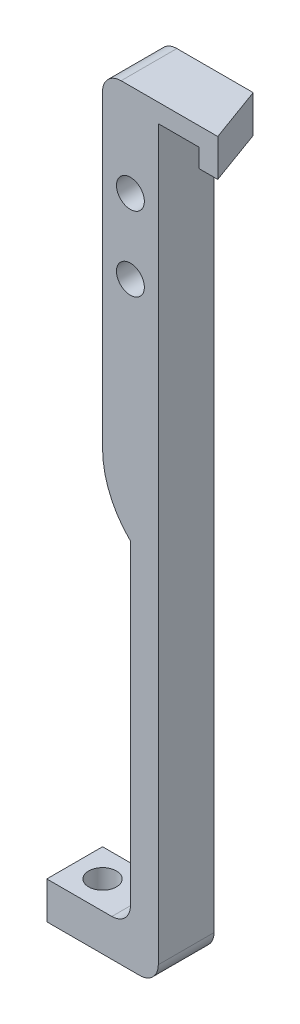
ISO-10303-21;
HEADER;
FILE_DESCRIPTION(('STEP AP214'),'2;1');
FILE_NAME('part.step','',(''),(''),'','','');
FILE_SCHEMA(('AUTOMOTIVE_DESIGN { 1 0 10303 214 1 1 1 1 }'));
ENDSEC;
DATA;
#1=APPLICATION_CONTEXT('core data for automotive mechanical design processes');
#2=APPLICATION_PROTOCOL_DEFINITION('international standard','automotive_design',2000,#1);
#3=PRODUCT_CONTEXT('',#1,'mechanical');
#4=PRODUCT('Part','Part','',(#3));
#5=PRODUCT_RELATED_PRODUCT_CATEGORY('part','',(#4));
#6=PRODUCT_DEFINITION_FORMATION('','',#4);
#7=PRODUCT_DEFINITION_CONTEXT('part definition',#1,'design');
#8=PRODUCT_DEFINITION('design','',#6,#7);
#9=PRODUCT_DEFINITION_SHAPE('','',#8);
#10=(LENGTH_UNIT() NAMED_UNIT(*) SI_UNIT(.MILLI.,.METRE.));
#11=(NAMED_UNIT(*) PLANE_ANGLE_UNIT() SI_UNIT($,.RADIAN.));
#12=(NAMED_UNIT(*) SI_UNIT($,.STERADIAN.) SOLID_ANGLE_UNIT());
#13=UNCERTAINTY_MEASURE_WITH_UNIT(LENGTH_MEASURE(1.E-05),#10,'distance_accuracy_value','');
#14=(GEOMETRIC_REPRESENTATION_CONTEXT(3) GLOBAL_UNCERTAINTY_ASSIGNED_CONTEXT((#13)) GLOBAL_UNIT_ASSIGNED_CONTEXT((#10,
#11,#12)) REPRESENTATION_CONTEXT('',''));
#15=CARTESIAN_POINT('',(0.,0.,0.));
#16=DIRECTION('',(0.,0.,1.));
#17=DIRECTION('',(1.,0.,0.));
#18=AXIS2_PLACEMENT_3D('',#15,#16,#17);
#19=CARTESIAN_POINT('',(15.748,102.108,0.));
#20=DIRECTION('',(0.,1.,0.));
#21=DIRECTION('',(0.,0.,1.));
#22=AXIS2_PLACEMENT_3D('',#19,#20,#21);
#23=PLANE('',#22);
#24=DIRECTION('',(-0.342020143325663,0.,-0.93969262078591));
#25=VECTOR('',#24,1.);
#26=CARTESIAN_POINT('',(10.4345468148915,102.108,-7.62));
#27=LINE('',#26,#25);
#28=CARTESIAN_POINT('',(13.2079999999999,102.108,0.));
#29=VERTEX_POINT('',#28);
#30=CARTESIAN_POINT('',(10.4345468148915,102.108,-7.62));
#31=VERTEX_POINT('',#30);
#32=EDGE_CURVE('E179',#29,#31,#27,.T.);
#33=ORIENTED_EDGE('',*,*,#32,.F.);
#34=DIRECTION('',(-1.,0.,0.));
#35=VECTOR('',#34,1.);
#36=CARTESIAN_POINT('',(15.748,102.108,0.));
#37=LINE('',#36,#35);
#38=CARTESIAN_POINT('',(7.62,102.108,0.));
#39=VERTEX_POINT('',#38);
#40=EDGE_CURVE('E221',#29,#39,#37,.T.);
#41=ORIENTED_EDGE('',*,*,#40,.T.);
#42=DIRECTION('',(0.,0.,-1.));
#43=VECTOR('',#42,1.);
#44=CARTESIAN_POINT('',(7.62,102.108,0.));
#45=LINE('',#44,#43);
#46=CARTESIAN_POINT('',(7.62,102.108,-7.62));
#47=VERTEX_POINT('',#46);
#48=EDGE_CURVE('E200',#39,#47,#45,.T.);
#49=ORIENTED_EDGE('',*,*,#48,.T.);
#50=DIRECTION('',(-1.,0.,0.));
#51=VECTOR('',#50,1.);
#52=CARTESIAN_POINT('',(15.748,102.108,-7.62));
#53=LINE('',#52,#51);
#54=EDGE_CURVE('E203',#31,#47,#53,.T.);
#55=ORIENTED_EDGE('',*,*,#54,.F.);
#56=EDGE_LOOP('',(#33,#41,#49,#55));
#57=FACE_BOUND('',#56,.T.);
#58=ADVANCED_FACE('F33',(#57),#23,.F.);
#59=CARTESIAN_POINT('',(7.62,0.,0.));
#60=DIRECTION('',(-1.,0.,0.));
#61=DIRECTION('',(0.,0.,1.));
#62=AXIS2_PLACEMENT_3D('',#59,#60,#61);
#63=PLANE('',#62);
#64=DIRECTION('',(0.,-1.,0.));
#65=VECTOR('',#64,1.);
#66=CARTESIAN_POINT('',(7.62,0.,0.));
#67=LINE('',#66,#65);
#68=CARTESIAN_POINT('',(7.62,2.54,0.));
#69=VERTEX_POINT('',#68);
#70=EDGE_CURVE('E212',#39,#69,#67,.T.);
#71=ORIENTED_EDGE('',*,*,#70,.T.);
#72=DIRECTION('',(0.,0.,-1.));
#73=VECTOR('',#72,1.);
#74=CARTESIAN_POINT('',(7.62,2.54,0.));
#75=LINE('',#74,#73);
#76=CARTESIAN_POINT('',(7.62,2.54,-7.62));
#77=VERTEX_POINT('',#76);
#78=EDGE_CURVE('E162',#69,#77,#75,.T.);
#79=ORIENTED_EDGE('',*,*,#78,.T.);
#80=DIRECTION('',(0.,1.,0.));
#81=VECTOR('',#80,1.);
#82=CARTESIAN_POINT('',(7.62,0.,-7.62));
#83=LINE('',#82,#81);
#84=EDGE_CURVE('E237',#77,#47,#83,.T.);
#85=ORIENTED_EDGE('',*,*,#84,.T.);
#86=ORIENTED_EDGE('',*,*,#48,.F.);
#87=EDGE_LOOP('',(#71,#79,#85,#86));
#88=FACE_BOUND('',#87,.T.);
#89=ADVANCED_FACE('F290',(#88),#63,.F.);
#90=CARTESIAN_POINT('',(7.62,0.,0.));
#91=DIRECTION('',(0.,0.,-1.));
#92=DIRECTION('',(-1.,0.,0.));
#93=AXIS2_PLACEMENT_3D('',#90,#91,#92);
#94=PLANE('',#93);
#95=CARTESIAN_POINT('',(3.81,81.788,0.));
#96=DIRECTION('',(0.,0.,1.));
#97=DIRECTION('',(1.,0.,0.));
#98=AXIS2_PLACEMENT_3D('',#95,#96,#97);
#99=CIRCLE('',#98,1.90500000000001);
#100=CARTESIAN_POINT('',(5.71500000000001,81.788,0.));
#101=VERTEX_POINT('',#100);
#102=EDGE_CURVE('E279',#101,#101,#99,.T.);
#103=ORIENTED_EDGE('',*,*,#102,.F.);
#104=EDGE_LOOP('',(#103));
#105=FACE_BOUND('',#104,.T.);
#106=CARTESIAN_POINT('',(3.81,91.948,0.));
#107=DIRECTION('',(0.,0.,1.));
#108=DIRECTION('',(1.,0.,0.));
#109=AXIS2_PLACEMENT_3D('',#106,#107,#108);
#110=CIRCLE('',#109,1.90500000000001);
#111=CARTESIAN_POINT('',(5.71500000000001,91.948,0.));
#112=VERTEX_POINT('',#111);
#113=EDGE_CURVE('E271',#112,#112,#110,.T.);
#114=ORIENTED_EDGE('',*,*,#113,.F.);
#115=EDGE_LOOP('',(#114));
#116=FACE_BOUND('',#115,.T.);
#117=DIRECTION('',(-1.,0.,0.));
#118=VECTOR('',#117,1.);
#119=CARTESIAN_POINT('',(7.62,0.,0.));
#120=LINE('',#119,#118);
#121=CARTESIAN_POINT('',(5.08,0.,0.));
#122=VERTEX_POINT('',#121);
#123=CARTESIAN_POINT('',(-7.62,0.,0.));
#124=VERTEX_POINT('',#123);
#125=EDGE_CURVE('E242',#122,#124,#120,.T.);
#126=ORIENTED_EDGE('',*,*,#125,.F.);
#127=CARTESIAN_POINT('',(5.08,2.54,0.));
#128=DIRECTION('',(0.,0.,-1.));
#129=DIRECTION('',(-1.,0.,0.));
#130=AXIS2_PLACEMENT_3D('',#127,#128,#129);
#131=CIRCLE('',#130,2.54);
#132=EDGE_CURVE('E260',#122,#69,#131,.F.);
#133=ORIENTED_EDGE('',*,*,#132,.T.);
#134=ORIENTED_EDGE('',*,*,#70,.F.);
#135=ORIENTED_EDGE('',*,*,#40,.F.);
#136=DIRECTION('',(0.,1.,0.));
#137=VECTOR('',#136,1.);
#138=CARTESIAN_POINT('',(13.2079999999999,99.568,0.));
#139=LINE('',#138,#137);
#140=CARTESIAN_POINT('',(13.2079999999999,99.568,0.));
#141=VERTEX_POINT('',#140);
#142=EDGE_CURVE('E197',#141,#29,#139,.T.);
#143=ORIENTED_EDGE('',*,*,#142,.F.);
#144=DIRECTION('',(-1.,0.,0.));
#145=VECTOR('',#144,1.);
#146=CARTESIAN_POINT('',(15.748,99.568,0.));
#147=LINE('',#146,#145);
#148=CARTESIAN_POINT('',(15.748,99.568,0.));
#149=VERTEX_POINT('',#148);
#150=EDGE_CURVE('E180',#149,#141,#147,.T.);
#151=ORIENTED_EDGE('',*,*,#150,.F.);
#152=DIRECTION('',(0.,-1.,0.));
#153=VECTOR('',#152,1.);
#154=CARTESIAN_POINT('',(15.748,104.648,0.));
#155=LINE('',#154,#153);
#156=CARTESIAN_POINT('',(15.748,104.648,0.));
#157=VERTEX_POINT('',#156);
#158=EDGE_CURVE('E201',#157,#149,#155,.T.);
#159=ORIENTED_EDGE('',*,*,#158,.F.);
#160=DIRECTION('',(-1.,0.,0.));
#161=VECTOR('',#160,1.);
#162=CARTESIAN_POINT('',(7.62,104.648,0.));
#163=LINE('',#162,#161);
#164=CARTESIAN_POINT('',(2.54,104.648,0.));
#165=VERTEX_POINT('',#164);
#166=EDGE_CURVE('E233',#157,#165,#163,.T.);
#167=ORIENTED_EDGE('',*,*,#166,.T.);
#168=CARTESIAN_POINT('',(2.54,102.108,0.));
#169=DIRECTION('',(0.,0.,-1.));
#170=DIRECTION('',(-1.,0.,0.));
#171=AXIS2_PLACEMENT_3D('',#168,#169,#170);
#172=CIRCLE('',#171,2.54);
#173=CARTESIAN_POINT('',(0.,102.108,0.));
#174=VERTEX_POINT('',#173);
#175=EDGE_CURVE('E50',#165,#174,#172,.F.);
#176=ORIENTED_EDGE('',*,*,#175,.T.);
#177=DIRECTION('',(0.,-1.,0.));
#178=VECTOR('',#177,1.);
#179=CARTESIAN_POINT('',(0.,0.,0.));
#180=LINE('',#179,#178);
#181=CARTESIAN_POINT('',(0.,59.8696141042494,0.));
#182=VERTEX_POINT('',#181);
#183=EDGE_CURVE('E158',#174,#182,#180,.T.);
#184=ORIENTED_EDGE('',*,*,#183,.T.);
#185=CARTESIAN_POINT('',(12.7,59.8696141042494,0.));
#186=DIRECTION('',(0.,0.,-1.));
#187=DIRECTION('',(-1.,0.,0.));
#188=AXIS2_PLACEMENT_3D('',#185,#186,#187);
#189=CIRCLE('',#188,12.7);
#190=CARTESIAN_POINT('',(3.81,50.8,0.));
#191=VERTEX_POINT('',#190);
#192=EDGE_CURVE('E154',#182,#191,#189,.F.);
#193=ORIENTED_EDGE('',*,*,#192,.T.);
#194=DIRECTION('',(0.,1.,0.));
#195=VECTOR('',#194,1.);
#196=CARTESIAN_POINT('',(3.81,5.08,0.));
#197=LINE('',#196,#195);
#198=CARTESIAN_POINT('',(3.81,7.62,0.));
#199=VERTEX_POINT('',#198);
#200=EDGE_CURVE('E142',#199,#191,#197,.T.);
#201=ORIENTED_EDGE('',*,*,#200,.F.);
#202=CARTESIAN_POINT('',(1.27,7.62,0.));
#203=DIRECTION('',(0.,0.,-1.));
#204=DIRECTION('',(-1.,0.,0.));
#205=AXIS2_PLACEMENT_3D('',#202,#203,#204);
#206=CIRCLE('',#205,2.54);
#207=CARTESIAN_POINT('',(1.27,5.08,0.));
#208=VERTEX_POINT('',#207);
#209=EDGE_CURVE('E42',#199,#208,#206,.T.);
#210=ORIENTED_EDGE('',*,*,#209,.T.);
#211=DIRECTION('',(1.,0.,0.));
#212=VECTOR('',#211,1.);
#213=CARTESIAN_POINT('',(-7.62,5.08,0.));
#214=LINE('',#213,#212);
#215=CARTESIAN_POINT('',(-7.62,5.08,0.));
#216=VERTEX_POINT('',#215);
#217=EDGE_CURVE('E247',#216,#208,#214,.T.);
#218=ORIENTED_EDGE('',*,*,#217,.F.);
#219=DIRECTION('',(0.,1.,0.));
#220=VECTOR('',#219,1.);
#221=CARTESIAN_POINT('',(-7.62,0.,0.));
#222=LINE('',#221,#220);
#223=EDGE_CURVE('E206',#124,#216,#222,.T.);
#224=ORIENTED_EDGE('',*,*,#223,.F.);
#225=EDGE_LOOP('',(#126,#133,#134,#135,#143,#151,#159,#167,#176,#184,#193,#201,#210,#218,#224));
#226=FACE_BOUND('',#225,.T.);
#227=ADVANCED_FACE('F156',(#105,#116,#226),#94,.F.);
#228=CARTESIAN_POINT('',(7.62,0.,0.));
#229=DIRECTION('',(0.,1.,0.));
#230=DIRECTION('',(0.,0.,1.));
#231=AXIS2_PLACEMENT_3D('',#228,#229,#230);
#232=PLANE('',#231);
#233=CARTESIAN_POINT('',(-3.81,0.,-3.81));
#234=DIRECTION('',(0.,1.,0.));
#235=DIRECTION('',(0.,0.,1.));
#236=AXIS2_PLACEMENT_3D('',#233,#234,#235);
#237=CIRCLE('',#236,1.89865);
#238=CARTESIAN_POINT('',(-3.81,0.,-1.91135));
#239=VERTEX_POINT('',#238);
#240=EDGE_CURVE('E176',#239,#239,#237,.T.);
#241=ORIENTED_EDGE('',*,*,#240,.T.);
#242=EDGE_LOOP('',(#241));
#243=FACE_BOUND('',#242,.T.);
#244=DIRECTION('',(-1.,0.,0.));
#245=VECTOR('',#244,1.);
#246=CARTESIAN_POINT('',(7.62,0.,-7.62));
#247=LINE('',#246,#245);
#248=CARTESIAN_POINT('',(5.08,0.,-7.62));
#249=VERTEX_POINT('',#248);
#250=CARTESIAN_POINT('',(-7.62,0.,-7.62));
#251=VERTEX_POINT('',#250);
#252=EDGE_CURVE('E240',#249,#251,#247,.T.);
#253=ORIENTED_EDGE('',*,*,#252,.F.);
#254=DIRECTION('',(0.,0.,-1.));
#255=VECTOR('',#254,1.);
#256=CARTESIAN_POINT('',(5.08,0.,0.));
#257=LINE('',#256,#255);
#258=EDGE_CURVE('E257',#249,#122,#257,.F.);
#259=ORIENTED_EDGE('',*,*,#258,.T.);
#260=ORIENTED_EDGE('',*,*,#125,.T.);
#261=DIRECTION('',(0.,0.,1.));
#262=VECTOR('',#261,1.);
#263=CARTESIAN_POINT('',(-7.62,0.,0.));
#264=LINE('',#263,#262);
#265=EDGE_CURVE('E248',#251,#124,#264,.T.);
#266=ORIENTED_EDGE('',*,*,#265,.F.);
#267=EDGE_LOOP('',(#253,#259,#260,#266));
#268=FACE_BOUND('',#267,.T.);
#269=ADVANCED_FACE('F289',(#243,#268),#232,.F.);
#270=CARTESIAN_POINT('',(7.62,0.,-7.62));
#271=DIRECTION('',(0.,0.,1.));
#272=DIRECTION('',(1.,0.,0.));
#273=AXIS2_PLACEMENT_3D('',#270,#271,#272);
#274=PLANE('',#273);
#275=CARTESIAN_POINT('',(3.81,81.788,-7.62));
#276=DIRECTION('',(0.,0.,1.));
#277=DIRECTION('',(1.,0.,0.));
#278=AXIS2_PLACEMENT_3D('',#275,#276,#277);
#279=CIRCLE('',#278,1.90500000000001);
#280=CARTESIAN_POINT('',(5.71500000000001,81.788,-7.62));
#281=VERTEX_POINT('',#280);
#282=EDGE_CURVE('E37',#281,#281,#279,.T.);
#283=ORIENTED_EDGE('',*,*,#282,.T.);
#284=EDGE_LOOP('',(#283));
#285=FACE_BOUND('',#284,.T.);
#286=CARTESIAN_POINT('',(3.81,91.948,-7.62));
#287=DIRECTION('',(0.,0.,1.));
#288=DIRECTION('',(1.,0.,0.));
#289=AXIS2_PLACEMENT_3D('',#286,#287,#288);
#290=CIRCLE('',#289,1.90500000000001);
#291=CARTESIAN_POINT('',(5.71500000000001,91.948,-7.62));
#292=VERTEX_POINT('',#291);
#293=EDGE_CURVE('E269',#292,#292,#290,.T.);
#294=ORIENTED_EDGE('',*,*,#293,.T.);
#295=EDGE_LOOP('',(#294));
#296=FACE_BOUND('',#295,.T.);
#297=ORIENTED_EDGE('',*,*,#84,.F.);
#298=CARTESIAN_POINT('',(5.08,2.54,-7.62));
#299=DIRECTION('',(0.,0.,1.));
#300=DIRECTION('',(1.,0.,0.));
#301=AXIS2_PLACEMENT_3D('',#298,#299,#300);
#302=CIRCLE('',#301,2.54);
#303=EDGE_CURVE('E334',#77,#249,#302,.F.);
#304=ORIENTED_EDGE('',*,*,#303,.T.);
#305=ORIENTED_EDGE('',*,*,#252,.T.);
#306=DIRECTION('',(0.,-1.,0.));
#307=VECTOR('',#306,1.);
#308=CARTESIAN_POINT('',(-7.62,0.,-7.62));
#309=LINE('',#308,#307);
#310=CARTESIAN_POINT('',(-7.62,5.08,-7.62));
#311=VERTEX_POINT('',#310);
#312=EDGE_CURVE('E347',#311,#251,#309,.T.);
#313=ORIENTED_EDGE('',*,*,#312,.F.);
#314=DIRECTION('',(1.,0.,0.));
#315=VECTOR('',#314,1.);
#316=CARTESIAN_POINT('',(-7.62,5.08,-7.62));
#317=LINE('',#316,#315);
#318=CARTESIAN_POINT('',(1.27,5.08,-7.62));
#319=VERTEX_POINT('',#318);
#320=EDGE_CURVE('E244',#311,#319,#317,.T.);
#321=ORIENTED_EDGE('',*,*,#320,.T.);
#322=CARTESIAN_POINT('',(1.27,7.62,-7.62));
#323=DIRECTION('',(0.,0.,1.));
#324=DIRECTION('',(1.,0.,0.));
#325=AXIS2_PLACEMENT_3D('',#322,#323,#324);
#326=CIRCLE('',#325,2.54);
#327=CARTESIAN_POINT('',(3.81,7.62,-7.62));
#328=VERTEX_POINT('',#327);
#329=EDGE_CURVE('E11',#319,#328,#326,.T.);
#330=ORIENTED_EDGE('',*,*,#329,.T.);
#331=DIRECTION('',(0.,-1.,0.));
#332=VECTOR('',#331,1.);
#333=CARTESIAN_POINT('',(3.81,5.08,-7.62));
#334=LINE('',#333,#332);
#335=CARTESIAN_POINT('',(3.81,50.8,-7.62));
#336=VERTEX_POINT('',#335);
#337=EDGE_CURVE('E151',#336,#328,#334,.T.);
#338=ORIENTED_EDGE('',*,*,#337,.F.);
#339=CARTESIAN_POINT('',(12.7,59.8696141042494,-7.62));
#340=DIRECTION('',(0.,0.,1.));
#341=DIRECTION('',(1.,0.,0.));
#342=AXIS2_PLACEMENT_3D('',#339,#340,#341);
#343=CIRCLE('',#342,12.7);
#344=CARTESIAN_POINT('',(0.,59.8696141042494,-7.62));
#345=VERTEX_POINT('',#344);
#346=EDGE_CURVE('E166',#336,#345,#343,.F.);
#347=ORIENTED_EDGE('',*,*,#346,.T.);
#348=DIRECTION('',(0.,1.,0.));
#349=VECTOR('',#348,1.);
#350=CARTESIAN_POINT('',(0.,0.,-7.62));
#351=LINE('',#350,#349);
#352=CARTESIAN_POINT('',(0.,102.108,-7.62));
#353=VERTEX_POINT('',#352);
#354=EDGE_CURVE('E223',#345,#353,#351,.T.);
#355=ORIENTED_EDGE('',*,*,#354,.T.);
#356=CARTESIAN_POINT('',(2.54,102.108,-7.62));
#357=DIRECTION('',(0.,0.,1.));
#358=DIRECTION('',(1.,0.,0.));
#359=AXIS2_PLACEMENT_3D('',#356,#357,#358);
#360=CIRCLE('',#359,2.54);
#361=CARTESIAN_POINT('',(2.54,104.648,-7.62));
#362=VERTEX_POINT('',#361);
#363=EDGE_CURVE('E361',#353,#362,#360,.F.);
#364=ORIENTED_EDGE('',*,*,#363,.T.);
#365=DIRECTION('',(-1.,0.,0.));
#366=VECTOR('',#365,1.);
#367=CARTESIAN_POINT('',(7.62,104.648,-7.62));
#368=LINE('',#367,#366);
#369=CARTESIAN_POINT('',(12.9745468148915,104.648,-7.62));
#370=VERTEX_POINT('',#369);
#371=EDGE_CURVE('E236',#370,#362,#368,.T.);
#372=ORIENTED_EDGE('',*,*,#371,.F.);
#373=DIRECTION('',(0.,1.,0.));
#374=VECTOR('',#373,1.);
#375=CARTESIAN_POINT('',(12.9745468148915,99.568,-7.62));
#376=LINE('',#375,#374);
#377=CARTESIAN_POINT('',(12.9745468148915,99.568,-7.62));
#378=VERTEX_POINT('',#377);
#379=EDGE_CURVE('E190',#378,#370,#376,.T.);
#380=ORIENTED_EDGE('',*,*,#379,.F.);
#381=DIRECTION('',(1.,0.,0.));
#382=VECTOR('',#381,1.);
#383=CARTESIAN_POINT('',(10.4345468148915,99.568,-7.62));
#384=LINE('',#383,#382);
#385=CARTESIAN_POINT('',(10.4345468148915,99.568,-7.62));
#386=VERTEX_POINT('',#385);
#387=EDGE_CURVE('E185',#386,#378,#384,.T.);
#388=ORIENTED_EDGE('',*,*,#387,.F.);
#389=DIRECTION('',(0.,1.,0.));
#390=VECTOR('',#389,1.);
#391=CARTESIAN_POINT('',(10.4345468148915,99.568,-7.62));
#392=LINE('',#391,#390);
#393=EDGE_CURVE('E194',#386,#31,#392,.T.);
#394=ORIENTED_EDGE('',*,*,#393,.T.);
#395=ORIENTED_EDGE('',*,*,#54,.T.);
#396=EDGE_LOOP('',(#297,#304,#305,#313,#321,#330,#338,#347,#355,#364,#372,#380,#388,#394,#395));
#397=FACE_BOUND('',#396,.T.);
#398=ADVANCED_FACE('F296',(#285,#296,#397),#274,.F.);
#399=CARTESIAN_POINT('',(7.62,104.648,0.));
#400=DIRECTION('',(0.,-1.,0.));
#401=DIRECTION('',(0.,0.,-1.));
#402=AXIS2_PLACEMENT_3D('',#399,#400,#401);
#403=PLANE('',#402);
#404=ORIENTED_EDGE('',*,*,#371,.T.);
#405=DIRECTION('',(0.,0.,1.));
#406=VECTOR('',#405,1.);
#407=CARTESIAN_POINT('',(2.54,104.648,0.));
#408=LINE('',#407,#406);
#409=EDGE_CURVE('E262',#362,#165,#408,.T.);
#410=ORIENTED_EDGE('',*,*,#409,.T.);
#411=ORIENTED_EDGE('',*,*,#166,.F.);
#412=DIRECTION('',(-0.342020143325669,0.,-0.939692620785908));
#413=VECTOR('',#412,1.);
#414=CARTESIAN_POINT('',(12.9745468148915,104.648,-7.62));
#415=LINE('',#414,#413);
#416=EDGE_CURVE('E167',#157,#370,#415,.T.);
#417=ORIENTED_EDGE('',*,*,#416,.T.);
#418=EDGE_LOOP('',(#404,#410,#411,#417));
#419=FACE_BOUND('',#418,.T.);
#420=ADVANCED_FACE('F322',(#419),#403,.F.);
#421=CARTESIAN_POINT('',(0.,0.,0.));
#422=DIRECTION('',(-1.,0.,0.));
#423=DIRECTION('',(0.,0.,1.));
#424=AXIS2_PLACEMENT_3D('',#421,#422,#423);
#425=PLANE('',#424);
#426=ORIENTED_EDGE('',*,*,#183,.F.);
#427=DIRECTION('',(0.,0.,1.));
#428=VECTOR('',#427,1.);
#429=CARTESIAN_POINT('',(0.,102.108,-7.62));
#430=LINE('',#429,#428);
#431=EDGE_CURVE('E264',#174,#353,#430,.F.);
#432=ORIENTED_EDGE('',*,*,#431,.T.);
#433=ORIENTED_EDGE('',*,*,#354,.F.);
#434=DIRECTION('',(0.,0.,1.));
#435=VECTOR('',#434,1.);
#436=CARTESIAN_POINT('',(0.,59.8696141042494,0.));
#437=LINE('',#436,#435);
#438=EDGE_CURVE('E163',#345,#182,#437,.T.);
#439=ORIENTED_EDGE('',*,*,#438,.T.);
#440=EDGE_LOOP('',(#426,#432,#433,#439));
#441=FACE_BOUND('',#440,.T.);
#442=ADVANCED_FACE('F317',(#441),#425,.T.);
#443=CARTESIAN_POINT('',(-7.62,5.08,0.));
#444=DIRECTION('',(0.,-1.,0.));
#445=DIRECTION('',(0.,0.,-1.));
#446=AXIS2_PLACEMENT_3D('',#443,#444,#445);
#447=PLANE('',#446);
#448=CARTESIAN_POINT('',(-3.81,5.08,-3.81));
#449=DIRECTION('',(0.,1.,0.));
#450=DIRECTION('',(0.,0.,1.));
#451=AXIS2_PLACEMENT_3D('',#448,#449,#450);
#452=CIRCLE('',#451,1.89865);
#453=CARTESIAN_POINT('',(-3.81,5.08,-1.91135));
#454=VERTEX_POINT('',#453);
#455=EDGE_CURVE('E170',#454,#454,#452,.T.);
#456=ORIENTED_EDGE('',*,*,#455,.F.);
#457=EDGE_LOOP('',(#456));
#458=FACE_BOUND('',#457,.T.);
#459=ORIENTED_EDGE('',*,*,#217,.T.);
#460=DIRECTION('',(0.,0.,1.));
#461=VECTOR('',#460,1.);
#462=CARTESIAN_POINT('',(1.27,5.08,-7.62));
#463=LINE('',#462,#461);
#464=EDGE_CURVE('E267',#208,#319,#463,.F.);
#465=ORIENTED_EDGE('',*,*,#464,.T.);
#466=ORIENTED_EDGE('',*,*,#320,.F.);
#467=DIRECTION('',(0.,0.,-1.));
#468=VECTOR('',#467,1.);
#469=CARTESIAN_POINT('',(-7.62,5.08,0.));
#470=LINE('',#469,#468);
#471=EDGE_CURVE('E349',#216,#311,#470,.T.);
#472=ORIENTED_EDGE('',*,*,#471,.F.);
#473=EDGE_LOOP('',(#459,#465,#466,#472));
#474=FACE_BOUND('',#473,.T.);
#475=ADVANCED_FACE('F314',(#458,#474),#447,.F.);
#476=CARTESIAN_POINT('',(-7.62,0.,0.));
#477=DIRECTION('',(-1.,0.,0.));
#478=DIRECTION('',(0.,0.,1.));
#479=AXIS2_PLACEMENT_3D('',#476,#477,#478);
#480=PLANE('',#479);
#481=ORIENTED_EDGE('',*,*,#223,.T.);
#482=ORIENTED_EDGE('',*,*,#471,.T.);
#483=ORIENTED_EDGE('',*,*,#312,.T.);
#484=ORIENTED_EDGE('',*,*,#265,.T.);
#485=EDGE_LOOP('',(#481,#482,#483,#484));
#486=FACE_BOUND('',#485,.T.);
#487=ADVANCED_FACE('F311',(#486),#480,.T.);
#488=CARTESIAN_POINT('',(10.4345468148915,99.568,-7.62));
#489=DIRECTION('',(0.939692620785911,0.,-0.342020143325663));
#490=DIRECTION('',(-0.342020143325663,0.,-0.939692620785911));
#491=AXIS2_PLACEMENT_3D('',#488,#489,#490);
#492=PLANE('',#491);
#493=ORIENTED_EDGE('',*,*,#32,.T.);
#494=ORIENTED_EDGE('',*,*,#393,.F.);
#495=DIRECTION('',(-0.342020143325663,0.,-0.93969262078591));
#496=VECTOR('',#495,1.);
#497=CARTESIAN_POINT('',(10.4345468148915,99.568,-7.62));
#498=LINE('',#497,#496);
#499=EDGE_CURVE('E183',#141,#386,#498,.T.);
#500=ORIENTED_EDGE('',*,*,#499,.F.);
#501=ORIENTED_EDGE('',*,*,#142,.T.);
#502=EDGE_LOOP('',(#493,#494,#500,#501));
#503=FACE_BOUND('',#502,.T.);
#504=ADVANCED_FACE('F309',(#503),#492,.F.);
#505=CARTESIAN_POINT('',(15.748,99.568,0.));
#506=DIRECTION('',(-0.939692620785908,0.,0.342020143325669));
#507=DIRECTION('',(0.342020143325669,0.,0.939692620785908));
#508=AXIS2_PLACEMENT_3D('',#505,#506,#507);
#509=PLANE('',#508);
#510=ORIENTED_EDGE('',*,*,#379,.T.);
#511=ORIENTED_EDGE('',*,*,#416,.F.);
#512=ORIENTED_EDGE('',*,*,#158,.T.);
#513=DIRECTION('',(0.342020143325669,0.,0.939692620785908));
#514=VECTOR('',#513,1.);
#515=CARTESIAN_POINT('',(15.748,99.568,0.));
#516=LINE('',#515,#514);
#517=EDGE_CURVE('E187',#378,#149,#516,.T.);
#518=ORIENTED_EDGE('',*,*,#517,.F.);
#519=EDGE_LOOP('',(#510,#511,#512,#518));
#520=FACE_BOUND('',#519,.T.);
#521=ADVANCED_FACE('F394',(#520),#509,.F.);
#522=CARTESIAN_POINT('',(0.,99.568,0.));
#523=DIRECTION('',(0.,1.,0.));
#524=DIRECTION('',(0.,0.,1.));
#525=AXIS2_PLACEMENT_3D('',#522,#523,#524);
#526=PLANE('',#525);
#527=ORIENTED_EDGE('',*,*,#150,.T.);
#528=ORIENTED_EDGE('',*,*,#499,.T.);
#529=ORIENTED_EDGE('',*,*,#387,.T.);
#530=ORIENTED_EDGE('',*,*,#517,.T.);
#531=EDGE_LOOP('',(#527,#528,#529,#530));
#532=FACE_BOUND('',#531,.T.);
#533=ADVANCED_FACE('F388',(#532),#526,.F.);
#534=CARTESIAN_POINT('',(-3.81,5.08,-3.81));
#535=DIRECTION('',(0.,1.,0.));
#536=DIRECTION('',(0.,0.,1.));
#537=AXIS2_PLACEMENT_3D('',#534,#535,#536);
#538=CYLINDRICAL_SURFACE('',#537,1.89865);
#539=ORIENTED_EDGE('',*,*,#240,.F.);
#540=EDGE_LOOP('',(#539));
#541=FACE_BOUND('',#540,.T.);
#542=ORIENTED_EDGE('',*,*,#455,.T.);
#543=EDGE_LOOP('',(#542));
#544=FACE_BOUND('',#543,.T.);
#545=ADVANCED_FACE('F383',(#541,#544),#538,.F.);
#546=CARTESIAN_POINT('',(3.81,0.,0.));
#547=DIRECTION('',(1.,0.,0.));
#548=DIRECTION('',(0.,0.,-1.));
#549=AXIS2_PLACEMENT_3D('',#546,#547,#548);
#550=PLANE('',#549);
#551=ORIENTED_EDGE('',*,*,#337,.T.);
#552=DIRECTION('',(0.,0.,1.));
#553=VECTOR('',#552,1.);
#554=CARTESIAN_POINT('',(3.81,7.62,0.));
#555=LINE('',#554,#553);
#556=EDGE_CURVE('E150',#328,#199,#555,.T.);
#557=ORIENTED_EDGE('',*,*,#556,.T.);
#558=ORIENTED_EDGE('',*,*,#200,.T.);
#559=DIRECTION('',(0.,0.,-1.));
#560=VECTOR('',#559,1.);
#561=CARTESIAN_POINT('',(3.81,50.8,-7.62));
#562=LINE('',#561,#560);
#563=EDGE_CURVE('E147',#191,#336,#562,.T.);
#564=ORIENTED_EDGE('',*,*,#563,.T.);
#565=EDGE_LOOP('',(#551,#557,#558,#564));
#566=FACE_BOUND('',#565,.T.);
#567=ADVANCED_FACE('F145',(#566),#550,.F.);
#568=CARTESIAN_POINT('',(12.7,59.8696141042494,-7.62));
#569=DIRECTION('',(0.,0.,-1.));
#570=DIRECTION('',(-1.,0.,0.));
#571=AXIS2_PLACEMENT_3D('',#568,#569,#570);
#572=CYLINDRICAL_SURFACE('',#571,12.7);
#573=ORIENTED_EDGE('',*,*,#192,.F.);
#574=ORIENTED_EDGE('',*,*,#438,.F.);
#575=ORIENTED_EDGE('',*,*,#346,.F.);
#576=ORIENTED_EDGE('',*,*,#563,.F.);
#577=EDGE_LOOP('',(#573,#574,#575,#576));
#578=FACE_BOUND('',#577,.T.);
#579=ADVANCED_FACE('F165',(#578),#572,.T.);
#580=CARTESIAN_POINT('',(5.08,2.54,0.));
#581=DIRECTION('',(0.,0.,-1.));
#582=DIRECTION('',(-1.,0.,0.));
#583=AXIS2_PLACEMENT_3D('',#580,#581,#582);
#584=CYLINDRICAL_SURFACE('',#583,2.54);
#585=ORIENTED_EDGE('',*,*,#132,.F.);
#586=ORIENTED_EDGE('',*,*,#258,.F.);
#587=ORIENTED_EDGE('',*,*,#303,.F.);
#588=ORIENTED_EDGE('',*,*,#78,.F.);
#589=EDGE_LOOP('',(#585,#586,#587,#588));
#590=FACE_BOUND('',#589,.T.);
#591=ADVANCED_FACE('F360',(#590),#584,.T.);
#592=CARTESIAN_POINT('',(2.54,102.108,0.));
#593=DIRECTION('',(0.,0.,-1.));
#594=DIRECTION('',(-1.,0.,0.));
#595=AXIS2_PLACEMENT_3D('',#592,#593,#594);
#596=CYLINDRICAL_SURFACE('',#595,2.54);
#597=ORIENTED_EDGE('',*,*,#363,.F.);
#598=ORIENTED_EDGE('',*,*,#431,.F.);
#599=ORIENTED_EDGE('',*,*,#175,.F.);
#600=ORIENTED_EDGE('',*,*,#409,.F.);
#601=EDGE_LOOP('',(#597,#598,#599,#600));
#602=FACE_BOUND('',#601,.T.);
#603=ADVANCED_FACE('F369',(#602),#596,.T.);
#604=CARTESIAN_POINT('',(1.27,7.62,0.));
#605=DIRECTION('',(0.,0.,-1.));
#606=DIRECTION('',(0.,1.,0.));
#607=AXIS2_PLACEMENT_3D('',#604,#605,#606);
#608=CYLINDRICAL_SURFACE('',#607,2.54);
#609=ORIENTED_EDGE('',*,*,#329,.F.);
#610=ORIENTED_EDGE('',*,*,#464,.F.);
#611=ORIENTED_EDGE('',*,*,#209,.F.);
#612=ORIENTED_EDGE('',*,*,#556,.F.);
#613=EDGE_LOOP('',(#609,#610,#611,#612));
#614=FACE_BOUND('',#613,.T.);
#615=ADVANCED_FACE('F35',(#614),#608,.F.);
#616=CARTESIAN_POINT('',(3.81,91.948,-7.62005));
#617=DIRECTION('',(0.,0.,1.));
#618=DIRECTION('',(1.,0.,0.));
#619=AXIS2_PLACEMENT_3D('',#616,#617,#618);
#620=CYLINDRICAL_SURFACE('',#619,1.90500000000001);
#621=ORIENTED_EDGE('',*,*,#113,.T.);
#622=EDGE_LOOP('',(#621));
#623=FACE_BOUND('',#622,.T.);
#624=ORIENTED_EDGE('',*,*,#293,.F.);
#625=EDGE_LOOP('',(#624));
#626=FACE_BOUND('',#625,.T.);
#627=ADVANCED_FACE('F368',(#623,#626),#620,.F.);
#628=CARTESIAN_POINT('',(3.81,81.788,-7.62005));
#629=DIRECTION('',(0.,0.,1.));
#630=DIRECTION('',(1.,0.,0.));
#631=AXIS2_PLACEMENT_3D('',#628,#629,#630);
#632=CYLINDRICAL_SURFACE('',#631,1.90500000000001);
#633=ORIENTED_EDGE('',*,*,#102,.T.);
#634=EDGE_LOOP('',(#633));
#635=FACE_BOUND('',#634,.T.);
#636=ORIENTED_EDGE('',*,*,#282,.F.);
#637=EDGE_LOOP('',(#636));
#638=FACE_BOUND('',#637,.T.);
#639=ADVANCED_FACE('F284',(#635,#638),#632,.F.);
#640=CLOSED_SHELL('',(#58,#89,#227,#269,#398,#420,#442,#475,#487,#504,#521,#533,#545,#567,#579,
#591,#603,#615,#627,#639));
#641=MANIFOLD_SOLID_BREP('B2',#640);
#642=ADVANCED_BREP_SHAPE_REPRESENTATION('',(#18,#641),#14);
#643=SHAPE_DEFINITION_REPRESENTATION(#9,#642);
ENDSEC;
END-ISO-10303-21;
